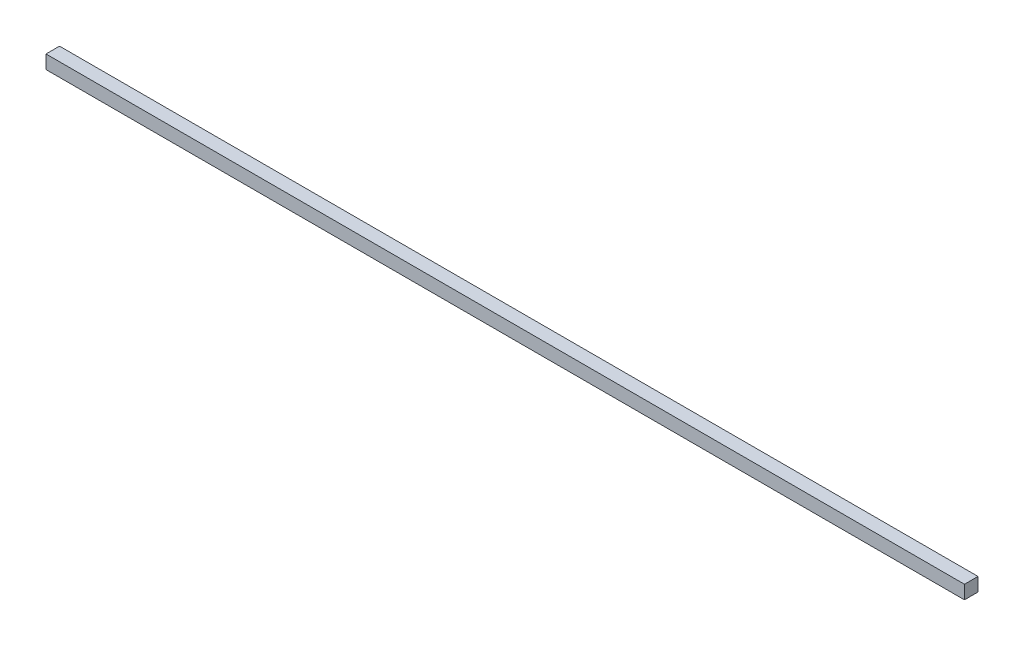
ISO-10303-21;
HEADER;
FILE_DESCRIPTION(('STEP AP214'),'2;1');
FILE_NAME('part.step','',(''),(''),'','','');
FILE_SCHEMA(('AUTOMOTIVE_DESIGN { 1 0 10303 214 1 1 1 1 }'));
ENDSEC;
DATA;
#1=APPLICATION_CONTEXT('core data for automotive mechanical design processes');
#2=APPLICATION_PROTOCOL_DEFINITION('international standard','automotive_design',2000,#1);
#3=PRODUCT_CONTEXT('',#1,'mechanical');
#4=PRODUCT('Part','Part','',(#3));
#5=PRODUCT_RELATED_PRODUCT_CATEGORY('part','',(#4));
#6=PRODUCT_DEFINITION_FORMATION('','',#4);
#7=PRODUCT_DEFINITION_CONTEXT('part definition',#1,'design');
#8=PRODUCT_DEFINITION('design','',#6,#7);
#9=PRODUCT_DEFINITION_SHAPE('','',#8);
#10=(LENGTH_UNIT() NAMED_UNIT(*) SI_UNIT(.MILLI.,.METRE.));
#11=(NAMED_UNIT(*) PLANE_ANGLE_UNIT() SI_UNIT($,.RADIAN.));
#12=(NAMED_UNIT(*) SI_UNIT($,.STERADIAN.) SOLID_ANGLE_UNIT());
#13=UNCERTAINTY_MEASURE_WITH_UNIT(LENGTH_MEASURE(1.E-05),#10,'distance_accuracy_value','');
#14=(GEOMETRIC_REPRESENTATION_CONTEXT(3) GLOBAL_UNCERTAINTY_ASSIGNED_CONTEXT((#13)) GLOBAL_UNIT_ASSIGNED_CONTEXT((#10,
#11,#12)) REPRESENTATION_CONTEXT('',''));
#15=CARTESIAN_POINT('',(0.,0.,0.));
#16=DIRECTION('',(0.,0.,1.));
#17=DIRECTION('',(1.,0.,0.));
#18=AXIS2_PLACEMENT_3D('',#15,#16,#17);
#19=CARTESIAN_POINT('',(0.,20.,0.));
#20=DIRECTION('',(1.,0.,0.));
#21=DIRECTION('',(0.,0.,-1.));
#22=AXIS2_PLACEMENT_3D('',#19,#20,#21);
#23=PLANE('',#22);
#24=DIRECTION('',(0.,0.,1.));
#25=VECTOR('',#24,1.);
#26=CARTESIAN_POINT('',(0.,0.,0.));
#27=LINE('',#26,#25);
#28=CARTESIAN_POINT('',(0.,0.,-20.));
#29=VERTEX_POINT('',#28);
#30=CARTESIAN_POINT('',(0.,0.,0.));
#31=VERTEX_POINT('',#30);
#32=EDGE_CURVE('E107',#29,#31,#27,.T.);
#33=ORIENTED_EDGE('',*,*,#32,.T.);
#34=DIRECTION('',(0.,-1.,0.));
#35=VECTOR('',#34,1.);
#36=CARTESIAN_POINT('',(0.,20.,0.));
#37=LINE('',#36,#35);
#38=CARTESIAN_POINT('',(0.,20.,0.));
#39=VERTEX_POINT('',#38);
#40=EDGE_CURVE('E11',#39,#31,#37,.T.);
#41=ORIENTED_EDGE('',*,*,#40,.F.);
#42=DIRECTION('',(0.,0.,1.));
#43=VECTOR('',#42,1.);
#44=CARTESIAN_POINT('',(0.,20.,0.));
#45=LINE('',#44,#43);
#46=CARTESIAN_POINT('',(0.,20.,-20.));
#47=VERTEX_POINT('',#46);
#48=EDGE_CURVE('E91',#47,#39,#45,.T.);
#49=ORIENTED_EDGE('',*,*,#48,.F.);
#50=DIRECTION('',(0.,-1.,0.));
#51=VECTOR('',#50,1.);
#52=CARTESIAN_POINT('',(0.,20.,-20.));
#53=LINE('',#52,#51);
#54=EDGE_CURVE('E103',#47,#29,#53,.T.);
#55=ORIENTED_EDGE('',*,*,#54,.T.);
#56=EDGE_LOOP('',(#33,#41,#49,#55));
#57=FACE_BOUND('',#56,.T.);
#58=ADVANCED_FACE('F39',(#57),#23,.F.);
#59=CARTESIAN_POINT('',(0.,20.,0.));
#60=DIRECTION('',(0.,0.,-1.));
#61=DIRECTION('',(-1.,0.,0.));
#62=AXIS2_PLACEMENT_3D('',#59,#60,#61);
#63=PLANE('',#62);
#64=DIRECTION('',(1.,0.,0.));
#65=VECTOR('',#64,1.);
#66=CARTESIAN_POINT('',(0.,0.,0.));
#67=LINE('',#66,#65);
#68=CARTESIAN_POINT('',(1357.,0.,0.));
#69=VERTEX_POINT('',#68);
#70=EDGE_CURVE('E96',#31,#69,#67,.T.);
#71=ORIENTED_EDGE('',*,*,#70,.T.);
#72=DIRECTION('',(0.,-1.,0.));
#73=VECTOR('',#72,1.);
#74=CARTESIAN_POINT('',(1357.,20.,0.));
#75=LINE('',#74,#73);
#76=CARTESIAN_POINT('',(1357.,20.,0.));
#77=VERTEX_POINT('',#76);
#78=EDGE_CURVE('E48',#77,#69,#75,.T.);
#79=ORIENTED_EDGE('',*,*,#78,.F.);
#80=DIRECTION('',(1.,0.,0.));
#81=VECTOR('',#80,1.);
#82=CARTESIAN_POINT('',(0.,20.,0.));
#83=LINE('',#82,#81);
#84=EDGE_CURVE('E86',#39,#77,#83,.T.);
#85=ORIENTED_EDGE('',*,*,#84,.F.);
#86=ORIENTED_EDGE('',*,*,#40,.T.);
#87=EDGE_LOOP('',(#71,#79,#85,#86));
#88=FACE_BOUND('',#87,.T.);
#89=ADVANCED_FACE('F95',(#88),#63,.F.);
#90=CARTESIAN_POINT('',(1357.,20.,0.));
#91=DIRECTION('',(-1.,0.,0.));
#92=DIRECTION('',(0.,0.,1.));
#93=AXIS2_PLACEMENT_3D('',#90,#91,#92);
#94=PLANE('',#93);
#95=DIRECTION('',(0.,0.,-1.));
#96=VECTOR('',#95,1.);
#97=CARTESIAN_POINT('',(1357.,0.,0.));
#98=LINE('',#97,#96);
#99=CARTESIAN_POINT('',(1357.,0.,-20.));
#100=VERTEX_POINT('',#99);
#101=EDGE_CURVE('E73',#69,#100,#98,.T.);
#102=ORIENTED_EDGE('',*,*,#101,.T.);
#103=DIRECTION('',(0.,-1.,0.));
#104=VECTOR('',#103,1.);
#105=CARTESIAN_POINT('',(1357.,20.,-20.));
#106=LINE('',#105,#104);
#107=CARTESIAN_POINT('',(1357.,20.,-20.));
#108=VERTEX_POINT('',#107);
#109=EDGE_CURVE('E98',#108,#100,#106,.T.);
#110=ORIENTED_EDGE('',*,*,#109,.F.);
#111=DIRECTION('',(0.,0.,-1.));
#112=VECTOR('',#111,1.);
#113=CARTESIAN_POINT('',(1357.,20.,0.));
#114=LINE('',#113,#112);
#115=EDGE_CURVE('E89',#77,#108,#114,.T.);
#116=ORIENTED_EDGE('',*,*,#115,.F.);
#117=ORIENTED_EDGE('',*,*,#78,.T.);
#118=EDGE_LOOP('',(#102,#110,#116,#117));
#119=FACE_BOUND('',#118,.T.);
#120=ADVANCED_FACE('F99',(#119),#94,.F.);
#121=CARTESIAN_POINT('',(0.,20.,-20.));
#122=DIRECTION('',(0.,0.,1.));
#123=DIRECTION('',(1.,0.,0.));
#124=AXIS2_PLACEMENT_3D('',#121,#122,#123);
#125=PLANE('',#124);
#126=DIRECTION('',(-1.,0.,0.));
#127=VECTOR('',#126,1.);
#128=CARTESIAN_POINT('',(0.,0.,-20.));
#129=LINE('',#128,#127);
#130=EDGE_CURVE('E79',#100,#29,#129,.T.);
#131=ORIENTED_EDGE('',*,*,#130,.T.);
#132=ORIENTED_EDGE('',*,*,#54,.F.);
#133=DIRECTION('',(-1.,0.,0.));
#134=VECTOR('',#133,1.);
#135=CARTESIAN_POINT('',(0.,20.,-20.));
#136=LINE('',#135,#134);
#137=EDGE_CURVE('E56',#108,#47,#136,.T.);
#138=ORIENTED_EDGE('',*,*,#137,.F.);
#139=ORIENTED_EDGE('',*,*,#109,.T.);
#140=EDGE_LOOP('',(#131,#132,#138,#139));
#141=FACE_BOUND('',#140,.T.);
#142=ADVANCED_FACE('F120',(#141),#125,.F.);
#143=CARTESIAN_POINT('',(0.,20.,0.));
#144=DIRECTION('',(0.,-1.,0.));
#145=DIRECTION('',(0.,0.,-1.));
#146=AXIS2_PLACEMENT_3D('',#143,#144,#145);
#147=PLANE('',#146);
#148=ORIENTED_EDGE('',*,*,#48,.T.);
#149=ORIENTED_EDGE('',*,*,#84,.T.);
#150=ORIENTED_EDGE('',*,*,#115,.T.);
#151=ORIENTED_EDGE('',*,*,#137,.T.);
#152=EDGE_LOOP('',(#148,#149,#150,#151));
#153=FACE_BOUND('',#152,.T.);
#154=ADVANCED_FACE('F87',(#153),#147,.F.);
#155=CARTESIAN_POINT('',(0.,0.,0.));
#156=DIRECTION('',(0.,-1.,0.));
#157=DIRECTION('',(0.,0.,-1.));
#158=AXIS2_PLACEMENT_3D('',#155,#156,#157);
#159=PLANE('',#158);
#160=ORIENTED_EDGE('',*,*,#32,.F.);
#161=ORIENTED_EDGE('',*,*,#130,.F.);
#162=ORIENTED_EDGE('',*,*,#101,.F.);
#163=ORIENTED_EDGE('',*,*,#70,.F.);
#164=EDGE_LOOP('',(#160,#161,#162,#163));
#165=FACE_BOUND('',#164,.T.);
#166=ADVANCED_FACE('F123',(#165),#159,.T.);
#167=CLOSED_SHELL('',(#58,#89,#120,#142,#154,#166));
#168=MANIFOLD_SOLID_BREP('B2',#167);
#169=ADVANCED_BREP_SHAPE_REPRESENTATION('',(#18,#168),#14);
#170=SHAPE_DEFINITION_REPRESENTATION(#9,#169);
ENDSEC;
END-ISO-10303-21;
